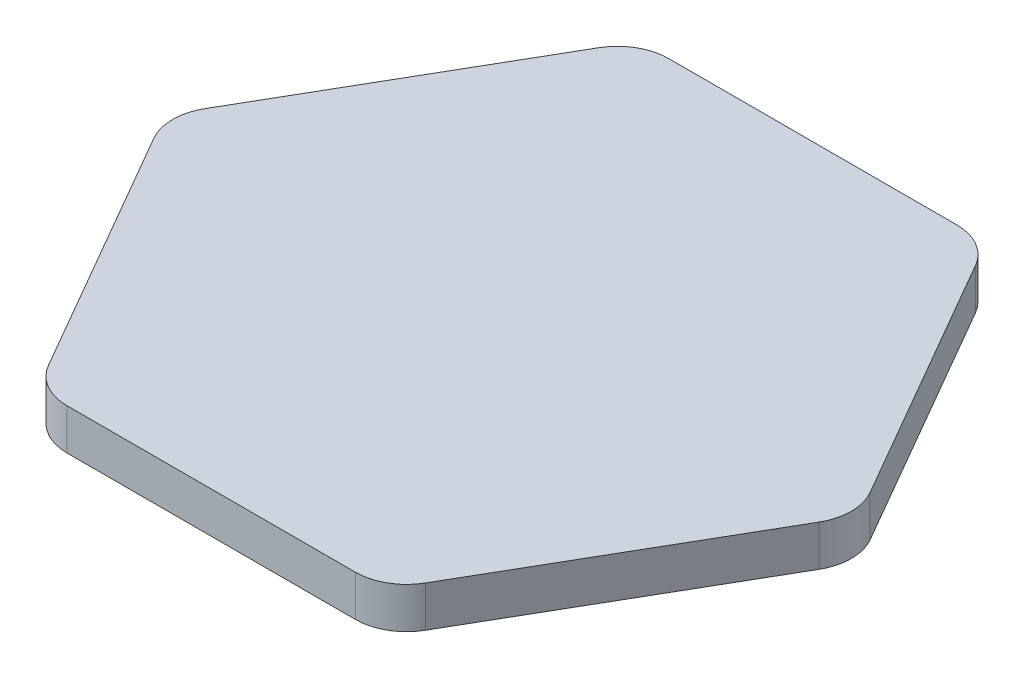
ISO-10303-21;
HEADER;
FILE_DESCRIPTION(('STEP AP214'),'2;1');
FILE_NAME('part.step','',(''),(''),'','','');
FILE_SCHEMA(('AUTOMOTIVE_DESIGN { 1 0 10303 214 1 1 1 1 }'));
ENDSEC;
DATA;
#1=APPLICATION_CONTEXT('core data for automotive mechanical design processes');
#2=APPLICATION_PROTOCOL_DEFINITION('international standard','automotive_design',2000,#1);
#3=PRODUCT_CONTEXT('',#1,'mechanical');
#4=PRODUCT('Part','Part','',(#3));
#5=PRODUCT_RELATED_PRODUCT_CATEGORY('part','',(#4));
#6=PRODUCT_DEFINITION_FORMATION('','',#4);
#7=PRODUCT_DEFINITION_CONTEXT('part definition',#1,'design');
#8=PRODUCT_DEFINITION('design','',#6,#7);
#9=PRODUCT_DEFINITION_SHAPE('','',#8);
#10=(LENGTH_UNIT() NAMED_UNIT(*) SI_UNIT(.MILLI.,.METRE.));
#11=(NAMED_UNIT(*) PLANE_ANGLE_UNIT() SI_UNIT($,.RADIAN.));
#12=(NAMED_UNIT(*) SI_UNIT($,.STERADIAN.) SOLID_ANGLE_UNIT());
#13=UNCERTAINTY_MEASURE_WITH_UNIT(LENGTH_MEASURE(1.E-05),#10,'distance_accuracy_value','');
#14=(GEOMETRIC_REPRESENTATION_CONTEXT(3) GLOBAL_UNCERTAINTY_ASSIGNED_CONTEXT((#13)) GLOBAL_UNIT_ASSIGNED_CONTEXT((#10,
#11,#12)) REPRESENTATION_CONTEXT('',''));
#15=CARTESIAN_POINT('',(0.,0.,0.));
#16=DIRECTION('',(0.,0.,1.));
#17=DIRECTION('',(1.,0.,0.));
#18=AXIS2_PLACEMENT_3D('',#15,#16,#17);
#19=CARTESIAN_POINT('',(-42.2043046777615,-12.,-73.1));
#20=DIRECTION('',(0.,1.,0.));
#21=DIRECTION('',(0.,0.,1.));
#22=AXIS2_PLACEMENT_3D('',#19,#20,#21);
#23=CYLINDRICAL_SURFACE('',#22,15.);
#24=CARTESIAN_POINT('',(-42.2043046777615,0.,-73.1));
#25=DIRECTION('',(0.,1.,0.));
#26=DIRECTION('',(0.,0.,1.));
#27=AXIS2_PLACEMENT_3D('',#24,#25,#26);
#28=CIRCLE('',#27,15.);
#29=CARTESIAN_POINT('',(-42.2043046777616,0.,-88.1));
#30=VERTEX_POINT('',#29);
#31=CARTESIAN_POINT('',(-55.194685734528,0.,-80.6000000000001));
#32=VERTEX_POINT('',#31);
#33=EDGE_CURVE('E162',#30,#32,#28,.T.);
#34=ORIENTED_EDGE('',*,*,#33,.F.);
#35=DIRECTION('',(0.,1.,0.));
#36=VECTOR('',#35,1.);
#37=CARTESIAN_POINT('',(-42.2043046777616,-12.,-88.1));
#38=LINE('',#37,#36);
#39=CARTESIAN_POINT('',(-42.2043046777616,-12.,-88.1));
#40=VERTEX_POINT('',#39);
#41=EDGE_CURVE('E11',#40,#30,#38,.T.);
#42=ORIENTED_EDGE('',*,*,#41,.F.);
#43=CARTESIAN_POINT('',(-42.2043046777615,-12.,-73.1));
#44=DIRECTION('',(0.,1.,0.));
#45=DIRECTION('',(0.,0.,1.));
#46=AXIS2_PLACEMENT_3D('',#43,#44,#45);
#47=CIRCLE('',#46,15.);
#48=CARTESIAN_POINT('',(-55.194685734528,-12.,-80.6000000000001));
#49=VERTEX_POINT('',#48);
#50=EDGE_CURVE('E194',#40,#49,#47,.T.);
#51=ORIENTED_EDGE('',*,*,#50,.T.);
#52=DIRECTION('',(0.,1.,0.));
#53=VECTOR('',#52,1.);
#54=CARTESIAN_POINT('',(-55.194685734528,-12.,-80.6000000000001));
#55=LINE('',#54,#53);
#56=EDGE_CURVE('E44',#49,#32,#55,.T.);
#57=ORIENTED_EDGE('',*,*,#56,.T.);
#58=EDGE_LOOP('',(#34,#42,#51,#57));
#59=FACE_BOUND('',#58,.T.);
#60=ADVANCED_FACE('F41',(#59),#23,.T.);
#61=CARTESIAN_POINT('',(42.2043046777617,-12.,-88.1));
#62=DIRECTION('',(0.,0.,-1.));
#63=DIRECTION('',(-1.,0.,0.));
#64=AXIS2_PLACEMENT_3D('',#61,#62,#63);
#65=PLANE('',#64);
#66=DIRECTION('',(-1.,0.,0.));
#67=VECTOR('',#66,1.);
#68=CARTESIAN_POINT('',(42.2043046777617,0.,-88.1));
#69=LINE('',#68,#67);
#70=CARTESIAN_POINT('',(42.2043046777617,0.,-88.1));
#71=VERTEX_POINT('',#70);
#72=EDGE_CURVE('E192',#71,#30,#69,.T.);
#73=ORIENTED_EDGE('',*,*,#72,.F.);
#74=DIRECTION('',(0.,1.,0.));
#75=VECTOR('',#74,1.);
#76=CARTESIAN_POINT('',(42.2043046777617,-12.,-88.1));
#77=LINE('',#76,#75);
#78=CARTESIAN_POINT('',(42.2043046777617,-12.,-88.1));
#79=VERTEX_POINT('',#78);
#80=EDGE_CURVE('E50',#79,#71,#77,.T.);
#81=ORIENTED_EDGE('',*,*,#80,.F.);
#82=DIRECTION('',(-1.,0.,0.));
#83=VECTOR('',#82,1.);
#84=CARTESIAN_POINT('',(42.2043046777617,-12.,-88.1));
#85=LINE('',#84,#83);
#86=EDGE_CURVE('E152',#79,#40,#85,.T.);
#87=ORIENTED_EDGE('',*,*,#86,.T.);
#88=ORIENTED_EDGE('',*,*,#41,.T.);
#89=EDGE_LOOP('',(#73,#81,#87,#88));
#90=FACE_BOUND('',#89,.T.);
#91=ADVANCED_FACE('F214',(#90),#65,.T.);
#92=CARTESIAN_POINT('',(42.2043046777616,-12.,-73.1));
#93=DIRECTION('',(0.,1.,0.));
#94=DIRECTION('',(0.,0.,1.));
#95=AXIS2_PLACEMENT_3D('',#92,#93,#94);
#96=CYLINDRICAL_SURFACE('',#95,15.);
#97=CARTESIAN_POINT('',(42.2043046777616,0.,-73.1));
#98=DIRECTION('',(0.,1.,0.));
#99=DIRECTION('',(0.,0.,1.));
#100=AXIS2_PLACEMENT_3D('',#97,#98,#99);
#101=CIRCLE('',#100,15.);
#102=CARTESIAN_POINT('',(55.1946857345283,0.,-80.5999999999998));
#103=VERTEX_POINT('',#102);
#104=EDGE_CURVE('E139',#103,#71,#101,.T.);
#105=ORIENTED_EDGE('',*,*,#104,.F.);
#106=DIRECTION('',(0.,1.,0.));
#107=VECTOR('',#106,1.);
#108=CARTESIAN_POINT('',(55.1946857345283,-12.,-80.5999999999998));
#109=LINE('',#108,#107);
#110=CARTESIAN_POINT('',(55.1946857345283,-12.,-80.5999999999998));
#111=VERTEX_POINT('',#110);
#112=EDGE_CURVE('E134',#111,#103,#109,.T.);
#113=ORIENTED_EDGE('',*,*,#112,.F.);
#114=CARTESIAN_POINT('',(42.2043046777616,-12.,-73.1));
#115=DIRECTION('',(0.,1.,0.));
#116=DIRECTION('',(0.,0.,1.));
#117=AXIS2_PLACEMENT_3D('',#114,#115,#116);
#118=CIRCLE('',#117,15.);
#119=EDGE_CURVE('E137',#111,#79,#118,.T.);
#120=ORIENTED_EDGE('',*,*,#119,.T.);
#121=ORIENTED_EDGE('',*,*,#80,.T.);
#122=EDGE_LOOP('',(#105,#113,#120,#121));
#123=FACE_BOUND('',#122,.T.);
#124=ADVANCED_FACE('F136',(#123),#96,.T.);
#125=CARTESIAN_POINT('',(97.3989904122892,-12.,-7.4999999999994));
#126=DIRECTION('',(0.866025403784444,0.,-0.499999999999991));
#127=DIRECTION('',(-0.499999999999991,0.,-0.866025403784444));
#128=AXIS2_PLACEMENT_3D('',#125,#126,#127);
#129=PLANE('',#128);
#130=DIRECTION('',(-0.499999999999991,0.,-0.866025403784444));
#131=VECTOR('',#130,1.);
#132=CARTESIAN_POINT('',(97.3989904122892,0.,-7.4999999999994));
#133=LINE('',#132,#131);
#134=CARTESIAN_POINT('',(97.3989904122892,0.,-7.4999999999994));
#135=VERTEX_POINT('',#134);
#136=EDGE_CURVE('E189',#135,#103,#133,.T.);
#137=ORIENTED_EDGE('',*,*,#136,.F.);
#138=DIRECTION('',(0.,1.,0.));
#139=VECTOR('',#138,1.);
#140=CARTESIAN_POINT('',(97.3989904122892,-12.,-7.4999999999994));
#141=LINE('',#140,#139);
#142=CARTESIAN_POINT('',(97.3989904122892,-12.,-7.4999999999994));
#143=VERTEX_POINT('',#142);
#144=EDGE_CURVE('E144',#143,#135,#141,.T.);
#145=ORIENTED_EDGE('',*,*,#144,.F.);
#146=DIRECTION('',(-0.499999999999991,0.,-0.866025403784444));
#147=VECTOR('',#146,1.);
#148=CARTESIAN_POINT('',(97.3989904122892,-12.,-7.4999999999994));
#149=LINE('',#148,#147);
#150=EDGE_CURVE('E150',#143,#111,#149,.T.);
#151=ORIENTED_EDGE('',*,*,#150,.T.);
#152=ORIENTED_EDGE('',*,*,#112,.T.);
#153=EDGE_LOOP('',(#137,#145,#151,#152));
#154=FACE_BOUND('',#153,.T.);
#155=ADVANCED_FACE('F154',(#154),#129,.T.);
#156=CARTESIAN_POINT('',(84.4086093555227,-12.,4.30211422042248E-13));
#157=DIRECTION('',(0.,1.,0.));
#158=DIRECTION('',(0.,0.,1.));
#159=AXIS2_PLACEMENT_3D('',#156,#157,#158);
#160=CYLINDRICAL_SURFACE('',#159,14.9999999999999);
#161=CARTESIAN_POINT('',(84.4086093555227,0.,4.30211422042248E-13));
#162=DIRECTION('',(0.,1.,0.));
#163=DIRECTION('',(0.,0.,1.));
#164=AXIS2_PLACEMENT_3D('',#161,#162,#163);
#165=CIRCLE('',#164,14.9999999999999);
#166=CARTESIAN_POINT('',(97.3989904122894,0.,7.49999999999997));
#167=VERTEX_POINT('',#166);
#168=EDGE_CURVE('E186',#167,#135,#165,.T.);
#169=ORIENTED_EDGE('',*,*,#168,.F.);
#170=DIRECTION('',(0.,1.,0.));
#171=VECTOR('',#170,1.);
#172=CARTESIAN_POINT('',(97.3989904122894,-12.,7.49999999999997));
#173=LINE('',#172,#171);
#174=CARTESIAN_POINT('',(97.3989904122894,-12.,7.49999999999997));
#175=VERTEX_POINT('',#174);
#176=EDGE_CURVE('E198',#175,#167,#173,.T.);
#177=ORIENTED_EDGE('',*,*,#176,.F.);
#178=CARTESIAN_POINT('',(84.4086093555227,-12.,4.30211422042248E-13));
#179=DIRECTION('',(0.,1.,0.));
#180=DIRECTION('',(0.,0.,1.));
#181=AXIS2_PLACEMENT_3D('',#178,#179,#180);
#182=CIRCLE('',#181,14.9999999999999);
#183=EDGE_CURVE('E155',#175,#143,#182,.T.);
#184=ORIENTED_EDGE('',*,*,#183,.T.);
#185=ORIENTED_EDGE('',*,*,#144,.T.);
#186=EDGE_LOOP('',(#169,#177,#184,#185));
#187=FACE_BOUND('',#186,.T.);
#188=ADVANCED_FACE('F227',(#187),#160,.T.);
#189=CARTESIAN_POINT('',(55.1946857345305,-12.,80.6000000000016));
#190=DIRECTION('',(0.866025403784457,0.,0.499999999999968));
#191=DIRECTION('',(0.499999999999968,0.,-0.866025403784457));
#192=AXIS2_PLACEMENT_3D('',#189,#190,#191);
#193=PLANE('',#192);
#194=DIRECTION('',(0.499999999999968,0.,-0.866025403784457));
#195=VECTOR('',#194,1.);
#196=CARTESIAN_POINT('',(55.1946857345305,0.,80.6000000000016));
#197=LINE('',#196,#195);
#198=CARTESIAN_POINT('',(55.1946857345305,0.,80.6000000000016));
#199=VERTEX_POINT('',#198);
#200=EDGE_CURVE('E183',#199,#167,#197,.T.);
#201=ORIENTED_EDGE('',*,*,#200,.F.);
#202=DIRECTION('',(0.,1.,0.));
#203=VECTOR('',#202,1.);
#204=CARTESIAN_POINT('',(55.1946857345305,-12.,80.6000000000016));
#205=LINE('',#204,#203);
#206=CARTESIAN_POINT('',(55.1946857345305,-12.,80.6000000000016));
#207=VERTEX_POINT('',#206);
#208=EDGE_CURVE('E200',#207,#199,#205,.T.);
#209=ORIENTED_EDGE('',*,*,#208,.F.);
#210=DIRECTION('',(0.499999999999968,0.,-0.866025403784457));
#211=VECTOR('',#210,1.);
#212=CARTESIAN_POINT('',(55.1946857345305,-12.,80.6000000000016));
#213=LINE('',#212,#211);
#214=EDGE_CURVE('E157',#207,#175,#213,.T.);
#215=ORIENTED_EDGE('',*,*,#214,.T.);
#216=ORIENTED_EDGE('',*,*,#176,.T.);
#217=EDGE_LOOP('',(#201,#209,#215,#216));
#218=FACE_BOUND('',#217,.T.);
#219=ADVANCED_FACE('F230',(#218),#193,.T.);
#220=CARTESIAN_POINT('',(42.2043046777637,-12.,73.100000000002));
#221=DIRECTION('',(0.,1.,0.));
#222=DIRECTION('',(0.,0.,1.));
#223=AXIS2_PLACEMENT_3D('',#220,#221,#222);
#224=CYLINDRICAL_SURFACE('',#223,15.);
#225=CARTESIAN_POINT('',(42.2043046777637,0.,73.100000000002));
#226=DIRECTION('',(0.,1.,0.));
#227=DIRECTION('',(0.,0.,1.));
#228=AXIS2_PLACEMENT_3D('',#225,#226,#227);
#229=CIRCLE('',#228,15.);
#230=CARTESIAN_POINT('',(42.204304677763,0.,88.100000000002));
#231=VERTEX_POINT('',#230);
#232=EDGE_CURVE('E180',#231,#199,#229,.T.);
#233=ORIENTED_EDGE('',*,*,#232,.F.);
#234=DIRECTION('',(0.,1.,0.));
#235=VECTOR('',#234,1.);
#236=CARTESIAN_POINT('',(42.204304677763,-12.,88.100000000002));
#237=LINE('',#236,#235);
#238=CARTESIAN_POINT('',(42.204304677763,-12.,88.100000000002));
#239=VERTEX_POINT('',#238);
#240=EDGE_CURVE('E202',#239,#231,#237,.T.);
#241=ORIENTED_EDGE('',*,*,#240,.F.);
#242=CARTESIAN_POINT('',(42.2043046777637,-12.,73.100000000002));
#243=DIRECTION('',(0.,1.,0.));
#244=DIRECTION('',(0.,0.,1.));
#245=AXIS2_PLACEMENT_3D('',#242,#243,#244);
#246=CIRCLE('',#245,15.);
#247=EDGE_CURVE('E384',#239,#207,#246,.T.);
#248=ORIENTED_EDGE('',*,*,#247,.T.);
#249=ORIENTED_EDGE('',*,*,#208,.T.);
#250=EDGE_LOOP('',(#233,#241,#248,#249));
#251=FACE_BOUND('',#250,.T.);
#252=ADVANCED_FACE('F234',(#251),#224,.T.);
#253=CARTESIAN_POINT('',(-42.2043046777603,-12.,88.0999999999985));
#254=DIRECTION('',(0.,0.,1.));
#255=DIRECTION('',(1.,0.,0.));
#256=AXIS2_PLACEMENT_3D('',#253,#254,#255);
#257=PLANE('',#256);
#258=DIRECTION('',(1.,0.,0.));
#259=VECTOR('',#258,1.);
#260=CARTESIAN_POINT('',(-42.2043046777603,0.,88.0999999999985));
#261=LINE('',#260,#259);
#262=CARTESIAN_POINT('',(-42.2043046777603,0.,88.0999999999985));
#263=VERTEX_POINT('',#262);
#264=EDGE_CURVE('E177',#263,#231,#261,.T.);
#265=ORIENTED_EDGE('',*,*,#264,.F.);
#266=DIRECTION('',(0.,1.,0.));
#267=VECTOR('',#266,1.);
#268=CARTESIAN_POINT('',(-42.2043046777603,-12.,88.0999999999985));
#269=LINE('',#268,#267);
#270=CARTESIAN_POINT('',(-42.2043046777603,-12.,88.0999999999985));
#271=VERTEX_POINT('',#270);
#272=EDGE_CURVE('E204',#271,#263,#269,.T.);
#273=ORIENTED_EDGE('',*,*,#272,.F.);
#274=DIRECTION('',(1.,0.,0.));
#275=VECTOR('',#274,1.);
#276=CARTESIAN_POINT('',(-42.2043046777603,-12.,88.0999999999985));
#277=LINE('',#276,#275);
#278=EDGE_CURVE('E388',#271,#239,#277,.T.);
#279=ORIENTED_EDGE('',*,*,#278,.T.);
#280=ORIENTED_EDGE('',*,*,#240,.T.);
#281=EDGE_LOOP('',(#265,#273,#279,#280));
#282=FACE_BOUND('',#281,.T.);
#283=ADVANCED_FACE('F238',(#282),#257,.T.);
#284=CARTESIAN_POINT('',(-42.2043046777596,-12.,73.0999999999986));
#285=DIRECTION('',(0.,1.,0.));
#286=DIRECTION('',(0.,0.,1.));
#287=AXIS2_PLACEMENT_3D('',#284,#285,#286);
#288=CYLINDRICAL_SURFACE('',#287,14.9999999999999);
#289=CARTESIAN_POINT('',(-42.2043046777596,0.,73.0999999999986));
#290=DIRECTION('',(0.,1.,0.));
#291=DIRECTION('',(0.,0.,1.));
#292=AXIS2_PLACEMENT_3D('',#289,#290,#291);
#293=CIRCLE('',#292,14.9999999999999);
#294=CARTESIAN_POINT('',(-55.194685734526,0.,80.5999999999989));
#295=VERTEX_POINT('',#294);
#296=EDGE_CURVE('E174',#295,#263,#293,.T.);
#297=ORIENTED_EDGE('',*,*,#296,.F.);
#298=DIRECTION('',(0.,1.,0.));
#299=VECTOR('',#298,1.);
#300=CARTESIAN_POINT('',(-55.194685734526,-12.,80.5999999999989));
#301=LINE('',#300,#299);
#302=CARTESIAN_POINT('',(-55.194685734526,-12.,80.5999999999989));
#303=VERTEX_POINT('',#302);
#304=EDGE_CURVE('E206',#303,#295,#301,.T.);
#305=ORIENTED_EDGE('',*,*,#304,.F.);
#306=CARTESIAN_POINT('',(-42.2043046777596,-12.,73.0999999999986));
#307=DIRECTION('',(0.,1.,0.));
#308=DIRECTION('',(0.,0.,1.));
#309=AXIS2_PLACEMENT_3D('',#306,#307,#308);
#310=CIRCLE('',#309,14.9999999999999);
#311=EDGE_CURVE('E377',#303,#271,#310,.T.);
#312=ORIENTED_EDGE('',*,*,#311,.T.);
#313=ORIENTED_EDGE('',*,*,#272,.T.);
#314=EDGE_LOOP('',(#297,#305,#312,#313));
#315=FACE_BOUND('',#314,.T.);
#316=ADVANCED_FACE('F242',(#315),#288,.T.);
#317=CARTESIAN_POINT('',(-97.3989904122897,-12.,7.50000000000003));
#318=DIRECTION('',(-0.866025403784425,0.,0.500000000000024));
#319=DIRECTION('',(0.500000000000024,0.,0.866025403784425));
#320=AXIS2_PLACEMENT_3D('',#317,#318,#319);
#321=PLANE('',#320);
#322=DIRECTION('',(0.500000000000024,0.,0.866025403784425));
#323=VECTOR('',#322,1.);
#324=CARTESIAN_POINT('',(-97.3989904122897,0.,7.50000000000003));
#325=LINE('',#324,#323);
#326=CARTESIAN_POINT('',(-97.3989904122897,0.,7.50000000000003));
#327=VERTEX_POINT('',#326);
#328=EDGE_CURVE('E171',#327,#295,#325,.T.);
#329=ORIENTED_EDGE('',*,*,#328,.F.);
#330=DIRECTION('',(0.,1.,0.));
#331=VECTOR('',#330,1.);
#332=CARTESIAN_POINT('',(-97.3989904122897,-12.,7.50000000000003));
#333=LINE('',#332,#331);
#334=CARTESIAN_POINT('',(-97.3989904122897,-12.,7.50000000000003));
#335=VERTEX_POINT('',#334);
#336=EDGE_CURVE('E208',#335,#327,#333,.T.);
#337=ORIENTED_EDGE('',*,*,#336,.F.);
#338=DIRECTION('',(0.500000000000024,0.,0.866025403784425));
#339=VECTOR('',#338,1.);
#340=CARTESIAN_POINT('',(-97.3989904122897,-12.,7.50000000000003));
#341=LINE('',#340,#339);
#342=EDGE_CURVE('E373',#335,#303,#341,.T.);
#343=ORIENTED_EDGE('',*,*,#342,.T.);
#344=ORIENTED_EDGE('',*,*,#304,.T.);
#345=EDGE_LOOP('',(#329,#337,#343,#344));
#346=FACE_BOUND('',#345,.T.);
#347=ADVANCED_FACE('F246',(#346),#321,.T.);
#348=CARTESIAN_POINT('',(-84.4086093555234,-12.,0.));
#349=DIRECTION('',(0.,1.,0.));
#350=DIRECTION('',(0.,0.,1.));
#351=AXIS2_PLACEMENT_3D('',#348,#349,#350);
#352=CYLINDRICAL_SURFACE('',#351,14.9999999999998);
#353=CARTESIAN_POINT('',(-84.4086093555234,0.,0.));
#354=DIRECTION('',(0.,1.,0.));
#355=DIRECTION('',(0.,0.,1.));
#356=AXIS2_PLACEMENT_3D('',#353,#354,#355);
#357=CIRCLE('',#356,14.9999999999998);
#358=CARTESIAN_POINT('',(-97.3989904122898,0.,-7.49999999999997));
#359=VERTEX_POINT('',#358);
#360=EDGE_CURVE('E168',#359,#327,#357,.T.);
#361=ORIENTED_EDGE('',*,*,#360,.F.);
#362=DIRECTION('',(0.,1.,0.));
#363=VECTOR('',#362,1.);
#364=CARTESIAN_POINT('',(-97.3989904122898,-12.,-7.49999999999997));
#365=LINE('',#364,#363);
#366=CARTESIAN_POINT('',(-97.3989904122898,-12.,-7.49999999999997));
#367=VERTEX_POINT('',#366);
#368=EDGE_CURVE('E209',#367,#359,#365,.T.);
#369=ORIENTED_EDGE('',*,*,#368,.F.);
#370=CARTESIAN_POINT('',(-84.4086093555234,-12.,0.));
#371=DIRECTION('',(0.,1.,0.));
#372=DIRECTION('',(0.,0.,1.));
#373=AXIS2_PLACEMENT_3D('',#370,#371,#372);
#374=CIRCLE('',#373,14.9999999999998);
#375=EDGE_CURVE('E394',#367,#335,#374,.T.);
#376=ORIENTED_EDGE('',*,*,#375,.T.);
#377=ORIENTED_EDGE('',*,*,#336,.T.);
#378=EDGE_LOOP('',(#361,#369,#376,#377));
#379=FACE_BOUND('',#378,.T.);
#380=ADVANCED_FACE('F250',(#379),#352,.T.);
#381=CARTESIAN_POINT('',(-55.194685734528,-12.,-80.6000000000001));
#382=DIRECTION('',(-0.866025403784438,0.,-0.500000000000002));
#383=DIRECTION('',(-0.500000000000002,0.,0.866025403784438));
#384=AXIS2_PLACEMENT_3D('',#381,#382,#383);
#385=PLANE('',#384);
#386=DIRECTION('',(-0.500000000000002,0.,0.866025403784438));
#387=VECTOR('',#386,1.);
#388=CARTESIAN_POINT('',(-55.194685734528,0.,-80.6000000000001));
#389=LINE('',#388,#387);
#390=EDGE_CURVE('E165',#32,#359,#389,.T.);
#391=ORIENTED_EDGE('',*,*,#390,.F.);
#392=ORIENTED_EDGE('',*,*,#56,.F.);
#393=DIRECTION('',(-0.500000000000002,0.,0.866025403784438));
#394=VECTOR('',#393,1.);
#395=CARTESIAN_POINT('',(-55.194685734528,-12.,-80.6000000000001));
#396=LINE('',#395,#394);
#397=EDGE_CURVE('E396',#49,#367,#396,.T.);
#398=ORIENTED_EDGE('',*,*,#397,.T.);
#399=ORIENTED_EDGE('',*,*,#368,.T.);
#400=EDGE_LOOP('',(#391,#392,#398,#399));
#401=FACE_BOUND('',#400,.T.);
#402=ADVANCED_FACE('F211',(#401),#385,.T.);
#403=CARTESIAN_POINT('',(-42.2043046777615,-12.,-73.1));
#404=DIRECTION('',(0.,1.,0.));
#405=DIRECTION('',(0.,0.,1.));
#406=AXIS2_PLACEMENT_3D('',#403,#404,#405);
#407=PLANE('',#406);
#408=ORIENTED_EDGE('',*,*,#50,.F.);
#409=ORIENTED_EDGE('',*,*,#86,.F.);
#410=ORIENTED_EDGE('',*,*,#119,.F.);
#411=ORIENTED_EDGE('',*,*,#150,.F.);
#412=ORIENTED_EDGE('',*,*,#183,.F.);
#413=ORIENTED_EDGE('',*,*,#214,.F.);
#414=ORIENTED_EDGE('',*,*,#247,.F.);
#415=ORIENTED_EDGE('',*,*,#278,.F.);
#416=ORIENTED_EDGE('',*,*,#311,.F.);
#417=ORIENTED_EDGE('',*,*,#342,.F.);
#418=ORIENTED_EDGE('',*,*,#375,.F.);
#419=ORIENTED_EDGE('',*,*,#397,.F.);
#420=EDGE_LOOP('',(#408,#409,#410,#411,#412,#413,#414,#415,#416,#417,#418,#419));
#421=FACE_BOUND('',#420,.T.);
#422=ADVANCED_FACE('F148',(#421),#407,.F.);
#423=CARTESIAN_POINT('',(-42.2043046777615,0.,-73.1));
#424=DIRECTION('',(0.,1.,0.));
#425=DIRECTION('',(0.,0.,1.));
#426=AXIS2_PLACEMENT_3D('',#423,#424,#425);
#427=PLANE('',#426);
#428=ORIENTED_EDGE('',*,*,#33,.T.);
#429=ORIENTED_EDGE('',*,*,#390,.T.);
#430=ORIENTED_EDGE('',*,*,#360,.T.);
#431=ORIENTED_EDGE('',*,*,#328,.T.);
#432=ORIENTED_EDGE('',*,*,#296,.T.);
#433=ORIENTED_EDGE('',*,*,#264,.T.);
#434=ORIENTED_EDGE('',*,*,#232,.T.);
#435=ORIENTED_EDGE('',*,*,#200,.T.);
#436=ORIENTED_EDGE('',*,*,#168,.T.);
#437=ORIENTED_EDGE('',*,*,#136,.T.);
#438=ORIENTED_EDGE('',*,*,#104,.T.);
#439=ORIENTED_EDGE('',*,*,#72,.T.);
#440=EDGE_LOOP('',(#428,#429,#430,#431,#432,#433,#434,#435,#436,#437,#438,#439));
#441=FACE_BOUND('',#440,.T.);
#442=ADVANCED_FACE('F213',(#441),#427,.T.);
#443=CLOSED_SHELL('',(#60,#91,#124,#155,#188,#219,#252,#283,#316,#347,#380,#402,#422,#442));
#444=MANIFOLD_SOLID_BREP('B2',#443);
#445=ADVANCED_BREP_SHAPE_REPRESENTATION('',(#18,#444),#14);
#446=SHAPE_DEFINITION_REPRESENTATION(#9,#445);
ENDSEC;
END-ISO-10303-21;
